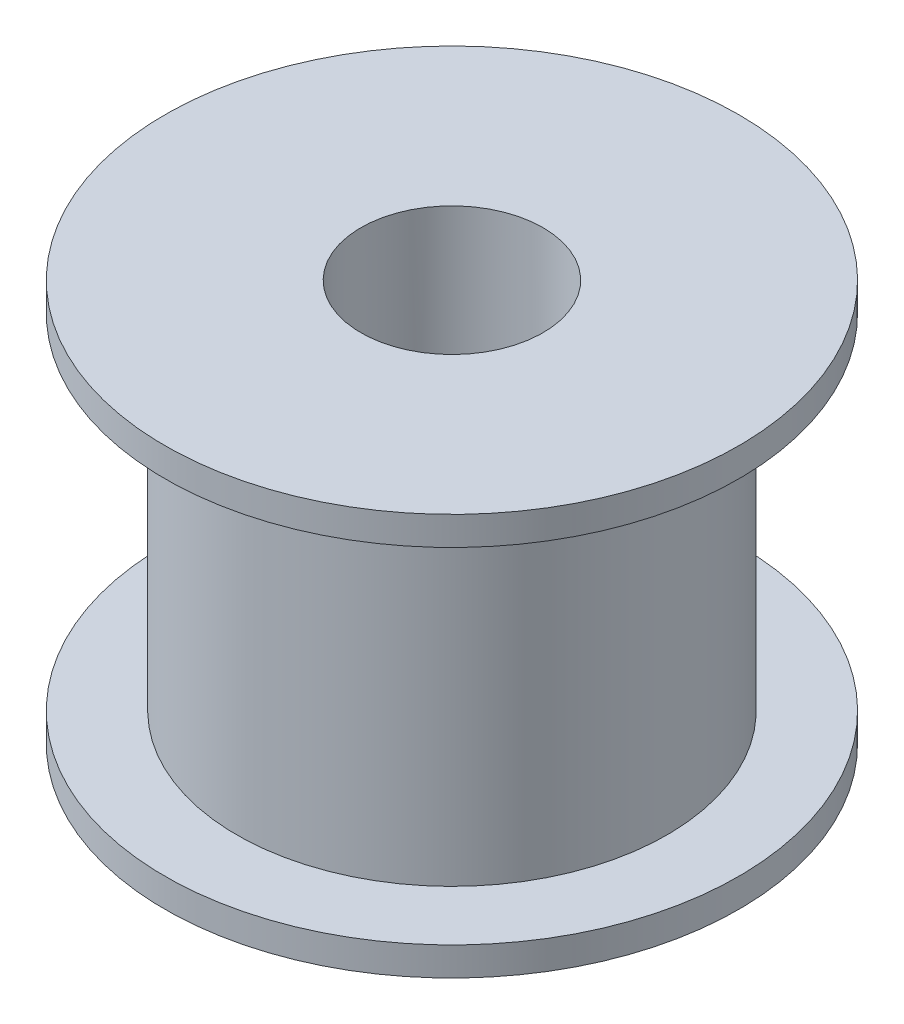
ISO-10303-21;
HEADER;
FILE_DESCRIPTION(('STEP AP214'),'2;1');
FILE_NAME('part.step','',(''),(''),'','','');
FILE_SCHEMA(('AUTOMOTIVE_DESIGN { 1 0 10303 214 1 1 1 1 }'));
ENDSEC;
DATA;
#1=APPLICATION_CONTEXT('core data for automotive mechanical design processes');
#2=APPLICATION_PROTOCOL_DEFINITION('international standard','automotive_design',2000,#1);
#3=PRODUCT_CONTEXT('',#1,'mechanical');
#4=PRODUCT('Part','Part','',(#3));
#5=PRODUCT_RELATED_PRODUCT_CATEGORY('part','',(#4));
#6=PRODUCT_DEFINITION_FORMATION('','',#4);
#7=PRODUCT_DEFINITION_CONTEXT('part definition',#1,'design');
#8=PRODUCT_DEFINITION('design','',#6,#7);
#9=PRODUCT_DEFINITION_SHAPE('','',#8);
#10=(LENGTH_UNIT() NAMED_UNIT(*) SI_UNIT(.MILLI.,.METRE.));
#11=(NAMED_UNIT(*) PLANE_ANGLE_UNIT() SI_UNIT($,.RADIAN.));
#12=(NAMED_UNIT(*) SI_UNIT($,.STERADIAN.) SOLID_ANGLE_UNIT());
#13=UNCERTAINTY_MEASURE_WITH_UNIT(LENGTH_MEASURE(1.E-05),#10,'distance_accuracy_value','');
#14=(GEOMETRIC_REPRESENTATION_CONTEXT(3) GLOBAL_UNCERTAINTY_ASSIGNED_CONTEXT((#13)) GLOBAL_UNIT_ASSIGNED_CONTEXT((#10,
#11,#12)) REPRESENTATION_CONTEXT('',''));
#15=CARTESIAN_POINT('',(0.,0.,0.));
#16=DIRECTION('',(0.,0.,1.));
#17=DIRECTION('',(1.,0.,0.));
#18=AXIS2_PLACEMENT_3D('',#15,#16,#17);
#19=CARTESIAN_POINT('',(-3.175,24.,0.));
#20=DIRECTION('',(0.,-1.,0.));
#21=DIRECTION('',(0.,0.,-1.));
#22=AXIS2_PLACEMENT_3D('',#19,#20,#21);
#23=PLANE('',#22);
#24=CARTESIAN_POINT('',(0.,24.,0.));
#25=DIRECTION('',(0.,-1.,0.));
#26=DIRECTION('',(0.,0.,-1.));
#27=AXIS2_PLACEMENT_3D('',#24,#25,#26);
#28=CIRCLE('',#27,10.);
#29=CARTESIAN_POINT('',(0.,24.,-10.));
#30=VERTEX_POINT('',#29);
#31=EDGE_CURVE('E10',#30,#30,#28,.T.);
#32=ORIENTED_EDGE('',*,*,#31,.F.);
#33=EDGE_LOOP('',(#32));
#34=FACE_BOUND('',#33,.T.);
#35=CARTESIAN_POINT('',(0.,24.,0.));
#36=DIRECTION('',(0.,-1.,0.));
#37=DIRECTION('',(0.,0.,-1.));
#38=AXIS2_PLACEMENT_3D('',#35,#36,#37);
#39=CIRCLE('',#38,3.175);
#40=CARTESIAN_POINT('',(0.,24.,-3.175));
#41=VERTEX_POINT('',#40);
#42=EDGE_CURVE('E58',#41,#41,#39,.T.);
#43=ORIENTED_EDGE('',*,*,#42,.T.);
#44=EDGE_LOOP('',(#43));
#45=FACE_BOUND('',#44,.T.);
#46=ADVANCED_FACE('F30',(#34,#45),#23,.F.);
#47=CARTESIAN_POINT('',(0.,0.,0.));
#48=DIRECTION('',(0.,-1.,0.));
#49=DIRECTION('',(0.,0.,-1.));
#50=AXIS2_PLACEMENT_3D('',#47,#48,#49);
#51=CYLINDRICAL_SURFACE('',#50,10.);
#52=CARTESIAN_POINT('',(0.,23.,0.));
#53=DIRECTION('',(0.,-1.,0.));
#54=DIRECTION('',(0.,0.,-1.));
#55=AXIS2_PLACEMENT_3D('',#52,#53,#54);
#56=CIRCLE('',#55,10.);
#57=CARTESIAN_POINT('',(0.,23.,-10.));
#58=VERTEX_POINT('',#57);
#59=EDGE_CURVE('E36',#58,#58,#56,.T.);
#60=ORIENTED_EDGE('',*,*,#59,.F.);
#61=EDGE_LOOP('',(#60));
#62=FACE_BOUND('',#61,.T.);
#63=ORIENTED_EDGE('',*,*,#31,.T.);
#64=EDGE_LOOP('',(#63));
#65=FACE_BOUND('',#64,.T.);
#66=ADVANCED_FACE('F137',(#62,#65),#51,.T.);
#67=CARTESIAN_POINT('',(-10.,23.,0.));
#68=DIRECTION('',(0.,1.,0.));
#69=DIRECTION('',(0.,0.,1.));
#70=AXIS2_PLACEMENT_3D('',#67,#68,#69);
#71=PLANE('',#70);
#72=CARTESIAN_POINT('',(0.,23.,0.));
#73=DIRECTION('',(0.,-1.,0.));
#74=DIRECTION('',(0.,0.,-1.));
#75=AXIS2_PLACEMENT_3D('',#72,#73,#74);
#76=CIRCLE('',#75,7.5);
#77=CARTESIAN_POINT('',(0.,23.,-7.5));
#78=VERTEX_POINT('',#77);
#79=EDGE_CURVE('E40',#78,#78,#76,.T.);
#80=ORIENTED_EDGE('',*,*,#79,.F.);
#81=EDGE_LOOP('',(#80));
#82=FACE_BOUND('',#81,.T.);
#83=ORIENTED_EDGE('',*,*,#59,.T.);
#84=EDGE_LOOP('',(#83));
#85=FACE_BOUND('',#84,.T.);
#86=ADVANCED_FACE('F131',(#82,#85),#71,.F.);
#87=CARTESIAN_POINT('',(0.,0.,0.));
#88=DIRECTION('',(0.,-1.,0.));
#89=DIRECTION('',(0.,0.,-1.));
#90=AXIS2_PLACEMENT_3D('',#87,#88,#89);
#91=CYLINDRICAL_SURFACE('',#90,7.5);
#92=CARTESIAN_POINT('',(-7.32734604068895,17.,-1.6));
#93=CARTESIAN_POINT('',(-7.32734783204889,16.9112314899289,-1.59999687521768));
#94=CARTESIAN_POINT('',(-7.32897670533243,16.8224249007057,-1.59258752711157));
#95=CARTESIAN_POINT('',(-7.33530494590012,16.6473332925828,-1.56317603196586));
#96=CARTESIAN_POINT('',(-7.3400066031465,16.5610502044393,-1.54116300148996));
#97=CARTESIAN_POINT('',(-7.35192423987446,16.3935637933243,-1.48326555897742));
#98=CARTESIAN_POINT('',(-7.3591375365424,16.3123551587954,-1.44739594342864));
#99=CARTESIAN_POINT('',(-7.37526247893005,16.1571077412959,-1.36284536038589));
#100=CARTESIAN_POINT('',(-7.38417407205336,16.0830687363883,-1.31416478963062));
#101=CARTESIAN_POINT('',(-7.40285153964238,15.9430701608376,-1.20454002688148));
#102=CARTESIAN_POINT('',(-7.4126278874916,15.8772426226148,-1.14342897607145));
#103=CARTESIAN_POINT('',(-7.43184148234544,15.7566908376894,-1.01103827358584));
#104=CARTESIAN_POINT('',(-7.44127870373573,15.7019674282403,-0.939757855827598));
#105=CARTESIAN_POINT('',(-7.45886446546389,15.6046579528831,-0.788169783859915));
#106=CARTESIAN_POINT('',(-7.46699920907061,15.5621984300098,-0.707779159305539));
#107=CARTESIAN_POINT('',(-7.48094533800134,15.4914400546686,-0.540801563567201));
#108=CARTESIAN_POINT('',(-7.48675697112518,15.4631396918008,-0.454215254422201));
#109=CARTESIAN_POINT('',(-7.4953280596337,15.4219169903913,-0.278676257286041));
#110=CARTESIAN_POINT('',(-7.49813179441585,15.4087713368266,-0.18977820986477));
#111=CARTESIAN_POINT('',(-7.5005244520832,15.3975334366144,-0.0109972872482612));
#112=CARTESIAN_POINT('',(-7.50011372555284,15.3994395483502,0.0788854794810509));
#113=CARTESIAN_POINT('',(-7.49615771852237,15.418083843682,0.255546402374117));
#114=CARTESIAN_POINT('',(-7.49266329963279,15.4345813702771,0.342351262803164));
#115=CARTESIAN_POINT('',(-7.48299031427627,15.4815572251576,0.511931382190348));
#116=CARTESIAN_POINT('',(-7.47681163040705,15.5120361649543,0.594706464721118));
#117=CARTESIAN_POINT('',(-7.46238195623953,15.5863255042797,0.754550882880952));
#118=CARTESIAN_POINT('',(-7.45411671633685,15.6302280308911,0.831576062489075));
#119=CARTESIAN_POINT('',(-7.43642166419509,15.7300497756313,0.97725415116399));
#120=CARTESIAN_POINT('',(-7.42699170062309,15.7859705559954,1.04590596996944));
#121=CARTESIAN_POINT('',(-7.40778511114788,15.9095546332628,1.1743189871499));
#122=CARTESIAN_POINT('',(-7.39800531840364,15.9774285621819,1.23387717194844));
#123=CARTESIAN_POINT('',(-7.37937693038443,16.1223014247692,1.34080220178098));
#124=CARTESIAN_POINT('',(-7.37052835793311,16.1993005819931,1.38816874804634));
#125=CARTESIAN_POINT('',(-7.35475651444397,16.3605554789535,1.46945010087399));
#126=CARTESIAN_POINT('',(-7.34783851514439,16.444830281057,1.50332818047939));
#127=CARTESIAN_POINT('',(-7.33678531116542,16.6180587849084,1.55638146230778));
#128=CARTESIAN_POINT('',(-7.33264968873186,16.7070117820952,1.57555887179257));
#129=CARTESIAN_POINT('',(-7.32771425542105,16.8852210599988,1.59835496135295));
#130=CARTESIAN_POINT('',(-7.32685123090565,16.9744379131568,1.60226852153074));
#131=CARTESIAN_POINT('',(-7.32838843572104,17.1522493322131,1.59522273599979));
#132=CARTESIAN_POINT('',(-7.33078845261626,17.2408439382445,1.58426435850705));
#133=CARTESIAN_POINT('',(-7.33852177157955,17.4138798323811,1.54804113817799));
#134=CARTESIAN_POINT('',(-7.34382205072082,17.4983564291054,1.52293726454489));
#135=CARTESIAN_POINT('',(-7.35672914405465,17.661904499286,1.45930930111439));
#136=CARTESIAN_POINT('',(-7.36433617007512,17.7409754755283,1.42078397878081));
#137=CARTESIAN_POINT('',(-7.38113944964658,17.8927480930833,1.3307517679701));
#138=CARTESIAN_POINT('',(-7.39035742068726,17.9653390209712,1.27906237846836));
#139=CARTESIAN_POINT('',(-7.40928600589101,18.1009246488958,1.16440942349652));
#140=CARTESIAN_POINT('',(-7.41899667801202,18.1639182164606,1.10144452944021));
#141=CARTESIAN_POINT('',(-7.43802394390857,18.2796576531446,0.964696649513287));
#142=CARTESIAN_POINT('',(-7.44733055372857,18.3322029692706,0.890742299881097));
#143=CARTESIAN_POINT('',(-7.46432047157701,18.424123625609,0.734884872162138));
#144=CARTESIAN_POINT('',(-7.47200385334324,18.4634995641094,0.652982155389736));
#145=CARTESIAN_POINT('',(-7.48483934479638,18.5276805415733,0.484049906499254));
#146=CARTESIAN_POINT('',(-7.49000699441327,18.5525752239163,0.397055665841012));
#147=CARTESIAN_POINT('',(-7.49729580275604,18.5873682679412,0.219997709997883));
#148=CARTESIAN_POINT('',(-7.49941738166686,18.5972686979895,0.129934419922699));
#149=CARTESIAN_POINT('',(-7.50036328067436,18.601703008245,-0.0487977681305984));
#150=CARTESIAN_POINT('',(-7.49925198227475,18.596536927014,-0.137459015607028));
#151=CARTESIAN_POINT('',(-7.49399416638132,18.5716534198474,-0.312618673313177));
#152=CARTESIAN_POINT('',(-7.48984769836304,18.5519362311057,-0.39911711877443));
#153=CARTESIAN_POINT('',(-7.47898934152454,18.4986509849526,-0.567277052878259));
#154=CARTESIAN_POINT('',(-7.47228498421878,18.4651235678675,-0.648951936497364));
#155=CARTESIAN_POINT('',(-7.4570285062036,18.385209972636,-0.805557846294832));
#156=CARTESIAN_POINT('',(-7.44847621571812,18.338822612891,-0.880488251937905));
#157=CARTESIAN_POINT('',(-7.43026476347601,18.233517517824,-1.02294779578885));
#158=CARTESIAN_POINT('',(-7.42058833247677,18.1743876801794,-1.09031795731115));
#159=CARTESIAN_POINT('',(-7.40131497163695,18.0457063611111,-1.21428232218523));
#160=CARTESIAN_POINT('',(-7.39171806140062,17.9761523860238,-1.27087393971624));
#161=CARTESIAN_POINT('',(-7.37355623892386,17.8275454385315,-1.37235806742357));
#162=CARTESIAN_POINT('',(-7.36500582897484,17.7483839701132,-1.41709443670196));
#163=CARTESIAN_POINT('',(-7.3500858193436,17.5835027379727,-1.49255808840325));
#164=CARTESIAN_POINT('',(-7.34371433542935,17.4977887194782,-1.5232974824127));
#165=CARTESIAN_POINT('',(-7.33507966715627,17.3432953684398,-1.56426527791603));
#166=CARTESIAN_POINT('',(-7.33219842078849,17.275367522962,-1.57764062026348));
#167=CARTESIAN_POINT('',(-7.32833095153541,17.1383007877673,-1.59550900254637));
#168=CARTESIAN_POINT('',(-7.32734464499187,17.0691619516495,-1.60000243460258));
#169=CARTESIAN_POINT('',(-7.32734604068895,17.,-1.6));
#170=B_SPLINE_CURVE_WITH_KNOTS('',3,(#92,#93,#94,#95,#96,#97,#98,#99,#100,#101,#102,#103,#104,
#105,#106,#107,#108,#109,#110,#111,#112,#113,#114,#115,#116,#117,#118,#119,#120,#121,#122,#123,
#124,#125,#126,#127,#128,#129,#130,#131,#132,#133,#134,#135,#136,#137,#138,#139,#140,#141,#142,
#143,#144,#145,#146,#147,#148,#149,#150,#151,#152,#153,#154,#155,#156,#157,#158,#159,#160,#161,
#162,#163,#164,#165,#166,#167,#168,#169),.UNSPECIFIED.,.T.,.F.,(4,2,2,2,2,2,2,2,2,2,2,2,2,2,2,2,
2,2,2,2,2,2,2,2,2,2,2,2,2,2,2,2,2,2,2,2,2,2,4),(0.,0.266052129745755,0.532302758678047,
0.798269859408133,1.06422872445041,1.33402614177927,1.60384389433342,1.87635365044247,
2.14883433092115,2.41724632343609,2.68562904207089,2.94966617354387,3.21371485442776,
3.47961802162733,3.74555577412269,4.01676058380499,4.28797203900696,4.55991699098621,
4.83182110323962,5.09844553370916,5.36505260681318,5.62868536677039,5.89234234338366,
6.15987500944547,6.42743921949375,6.69972716505267,6.9720027388247,7.24257439749418,
7.51310872903873,7.7782925828225,8.043472114006,8.3078767955156,8.57230577914047,
8.84153310165344,9.11082493186949,9.38350466142434,9.6559479906485,9.86324556645522,
10.0705339902329),.UNSPECIFIED.);
#171=CARTESIAN_POINT('',(-7.32734604068895,17.,-1.6));
#172=VERTEX_POINT('',#171);
#173=EDGE_CURVE('E91',#172,#172,#170,.T.);
#174=ORIENTED_EDGE('',*,*,#173,.F.);
#175=EDGE_LOOP('',(#174));
#176=FACE_BOUND('',#175,.T.);
#177=CARTESIAN_POINT('',(1.6,17.,-7.32734604068895));
#178=CARTESIAN_POINT('',(1.59999687521768,16.9112314899289,-7.32734783204889));
#179=CARTESIAN_POINT('',(1.59258752711157,16.8224249007057,-7.32897670533243));
#180=CARTESIAN_POINT('',(1.56317603196586,16.6473332925828,-7.33530494590012));
#181=CARTESIAN_POINT('',(1.54116300148996,16.5610502044393,-7.3400066031465));
#182=CARTESIAN_POINT('',(1.48326555897742,16.3935637933243,-7.35192423987446));
#183=CARTESIAN_POINT('',(1.44739594342864,16.3123551587954,-7.3591375365424));
#184=CARTESIAN_POINT('',(1.36284536038589,16.1571077412959,-7.37526247893005));
#185=CARTESIAN_POINT('',(1.31416478963062,16.0830687363883,-7.38417407205336));
#186=CARTESIAN_POINT('',(1.20454002688148,15.9430701608376,-7.40285153964238));
#187=CARTESIAN_POINT('',(1.14342897607145,15.8772426226148,-7.4126278874916));
#188=CARTESIAN_POINT('',(1.01103827358584,15.7566908376894,-7.43184148234544));
#189=CARTESIAN_POINT('',(0.939757855827598,15.7019674282403,-7.44127870373573));
#190=CARTESIAN_POINT('',(0.788169783859915,15.6046579528831,-7.45886446546389));
#191=CARTESIAN_POINT('',(0.707779159305539,15.5621984300098,-7.46699920907061));
#192=CARTESIAN_POINT('',(0.540801563567201,15.4914400546686,-7.48094533800134));
#193=CARTESIAN_POINT('',(0.4542152544222,15.4631396918008,-7.48675697112518));
#194=CARTESIAN_POINT('',(0.278676257286041,15.4219169903913,-7.4953280596337));
#195=CARTESIAN_POINT('',(0.189778209864771,15.4087713368266,-7.49813179441585));
#196=CARTESIAN_POINT('',(0.0109972872482615,15.3975334366144,-7.5005244520832));
#197=CARTESIAN_POINT('',(-0.0788854794810507,15.3994395483502,-7.50011372555284));
#198=CARTESIAN_POINT('',(-0.255546402374117,15.418083843682,-7.49615771852237));
#199=CARTESIAN_POINT('',(-0.342351262803164,15.4345813702771,-7.49266329963279));
#200=CARTESIAN_POINT('',(-0.511931382190348,15.4815572251576,-7.48299031427627));
#201=CARTESIAN_POINT('',(-0.594706464721118,15.5120361649543,-7.47681163040705));
#202=CARTESIAN_POINT('',(-0.754550882880952,15.5863255042797,-7.46238195623953));
#203=CARTESIAN_POINT('',(-0.831576062489075,15.6302280308911,-7.45411671633685));
#204=CARTESIAN_POINT('',(-0.97725415116399,15.7300497756313,-7.43642166419509));
#205=CARTESIAN_POINT('',(-1.04590596996944,15.7859705559954,-7.42699170062309));
#206=CARTESIAN_POINT('',(-1.1743189871499,15.9095546332628,-7.40778511114788));
#207=CARTESIAN_POINT('',(-1.23387717194844,15.9774285621819,-7.39800531840364));
#208=CARTESIAN_POINT('',(-1.34080220178098,16.1223014247692,-7.37937693038443));
#209=CARTESIAN_POINT('',(-1.38816874804634,16.1993005819931,-7.37052835793311));
#210=CARTESIAN_POINT('',(-1.46945010087399,16.3605554789535,-7.35475651444397));
#211=CARTESIAN_POINT('',(-1.50332818047939,16.444830281057,-7.34783851514439));
#212=CARTESIAN_POINT('',(-1.55638146230778,16.6180587849084,-7.33678531116542));
#213=CARTESIAN_POINT('',(-1.57555887179257,16.7070117820952,-7.33264968873186));
#214=CARTESIAN_POINT('',(-1.59835496135295,16.8852210599988,-7.32771425542105));
#215=CARTESIAN_POINT('',(-1.60226852153074,16.9744379131568,-7.32685123090565));
#216=CARTESIAN_POINT('',(-1.59522273599979,17.1522493322131,-7.32838843572104));
#217=CARTESIAN_POINT('',(-1.58426435850705,17.2408439382445,-7.33078845261626));
#218=CARTESIAN_POINT('',(-1.54804113817799,17.4138798323811,-7.33852177157955));
#219=CARTESIAN_POINT('',(-1.52293726454489,17.4983564291054,-7.34382205072082));
#220=CARTESIAN_POINT('',(-1.45930930111439,17.661904499286,-7.35672914405465));
#221=CARTESIAN_POINT('',(-1.42078397878081,17.7409754755283,-7.36433617007512));
#222=CARTESIAN_POINT('',(-1.3307517679701,17.8927480930833,-7.38113944964658));
#223=CARTESIAN_POINT('',(-1.27906237846836,17.9653390209712,-7.39035742068726));
#224=CARTESIAN_POINT('',(-1.16440942349652,18.1009246488958,-7.40928600589101));
#225=CARTESIAN_POINT('',(-1.10144452944021,18.1639182164606,-7.41899667801202));
#226=CARTESIAN_POINT('',(-0.964696649513287,18.2796576531446,-7.43802394390857));
#227=CARTESIAN_POINT('',(-0.890742299881097,18.3322029692706,-7.44733055372857));
#228=CARTESIAN_POINT('',(-0.734884872162138,18.424123625609,-7.46432047157701));
#229=CARTESIAN_POINT('',(-0.652982155389736,18.4634995641094,-7.47200385334324));
#230=CARTESIAN_POINT('',(-0.484049906499254,18.5276805415733,-7.48483934479638));
#231=CARTESIAN_POINT('',(-0.397055665841012,18.5525752239163,-7.49000699441327));
#232=CARTESIAN_POINT('',(-0.219997709997883,18.5873682679412,-7.49729580275604));
#233=CARTESIAN_POINT('',(-0.129934419922699,18.5972686979895,-7.49941738166686));
#234=CARTESIAN_POINT('',(0.0487977681305985,18.601703008245,-7.50036328067436));
#235=CARTESIAN_POINT('',(0.137459015607028,18.596536927014,-7.49925198227475));
#236=CARTESIAN_POINT('',(0.312618673313177,18.5716534198474,-7.49399416638132));
#237=CARTESIAN_POINT('',(0.39911711877443,18.5519362311057,-7.48984769836304));
#238=CARTESIAN_POINT('',(0.567277052878258,18.4986509849526,-7.47898934152454));
#239=CARTESIAN_POINT('',(0.648951936497363,18.4651235678675,-7.47228498421878));
#240=CARTESIAN_POINT('',(0.805557846294832,18.385209972636,-7.4570285062036));
#241=CARTESIAN_POINT('',(0.880488251937906,18.338822612891,-7.44847621571812));
#242=CARTESIAN_POINT('',(1.02294779578885,18.233517517824,-7.43026476347601));
#243=CARTESIAN_POINT('',(1.09031795731116,18.1743876801794,-7.42058833247677));
#244=CARTESIAN_POINT('',(1.21428232218523,18.0457063611111,-7.40131497163695));
#245=CARTESIAN_POINT('',(1.27087393971624,17.9761523860238,-7.39171806140062));
#246=CARTESIAN_POINT('',(1.37235806742357,17.8275454385315,-7.37355623892386));
#247=CARTESIAN_POINT('',(1.41709443670196,17.7483839701132,-7.36500582897484));
#248=CARTESIAN_POINT('',(1.49255808840325,17.5835027379727,-7.3500858193436));
#249=CARTESIAN_POINT('',(1.5232974824127,17.4977887194782,-7.34371433542935));
#250=CARTESIAN_POINT('',(1.56426527791603,17.3432953684398,-7.33507966715627));
#251=CARTESIAN_POINT('',(1.57764062026348,17.275367522962,-7.33219842078849));
#252=CARTESIAN_POINT('',(1.59550900254637,17.1383007877673,-7.32833095153541));
#253=CARTESIAN_POINT('',(1.60000243460258,17.0691619516495,-7.32734464499187));
#254=CARTESIAN_POINT('',(1.6,17.,-7.32734604068895));
#255=B_SPLINE_CURVE_WITH_KNOTS('',3,(#177,#178,#179,#180,#181,#182,#183,#184,#185,#186,#187,
#188,#189,#190,#191,#192,#193,#194,#195,#196,#197,#198,#199,#200,#201,#202,#203,#204,#205,#206,
#207,#208,#209,#210,#211,#212,#213,#214,#215,#216,#217,#218,#219,#220,#221,#222,#223,#224,#225,
#226,#227,#228,#229,#230,#231,#232,#233,#234,#235,#236,#237,#238,#239,#240,#241,#242,#243,#244,
#245,#246,#247,#248,#249,#250,#251,#252,#253,#254),.UNSPECIFIED.,.T.,.F.,(4,2,2,2,2,2,2,2,2,2,2,
2,2,2,2,2,2,2,2,2,2,2,2,2,2,2,2,2,2,2,2,2,2,2,2,2,2,2,4),(0.,0.266052129745755,
0.532302758678047,0.798269859408133,1.06422872445041,1.33402614177927,1.60384389433342,
1.87635365044247,2.14883433092115,2.41724632343609,2.68562904207089,2.94966617354387,
3.21371485442776,3.47961802162733,3.74555577412269,4.01676058380499,4.28797203900696,
4.55991699098621,4.83182110323963,5.09844553370916,5.36505260681319,5.62868536677039,
5.89234234338366,6.15987500944547,6.42743921949376,6.69972716505267,6.9720027388247,
7.24257439749418,7.51310872903874,7.77829258282251,8.043472114006,8.3078767955156,
8.57230577914047,8.84153310165344,9.11082493186949,9.38350466142434,9.6559479906485,
9.86324556645523,10.0705339902329),.UNSPECIFIED.);
#256=CARTESIAN_POINT('',(1.6,17.,-7.32734604068895));
#257=VERTEX_POINT('',#256);
#258=EDGE_CURVE('E61',#257,#257,#255,.T.);
#259=ORIENTED_EDGE('',*,*,#258,.F.);
#260=EDGE_LOOP('',(#259));
#261=FACE_BOUND('',#260,.T.);
#262=CARTESIAN_POINT('',(0.,11.,0.));
#263=DIRECTION('',(0.,-1.,0.));
#264=DIRECTION('',(0.,0.,-1.));
#265=AXIS2_PLACEMENT_3D('',#262,#263,#264);
#266=CIRCLE('',#265,7.5);
#267=CARTESIAN_POINT('',(0.,11.,-7.5));
#268=VERTEX_POINT('',#267);
#269=EDGE_CURVE('E44',#268,#268,#266,.T.);
#270=ORIENTED_EDGE('',*,*,#269,.F.);
#271=EDGE_LOOP('',(#270));
#272=FACE_BOUND('',#271,.T.);
#273=ORIENTED_EDGE('',*,*,#79,.T.);
#274=EDGE_LOOP('',(#273));
#275=FACE_BOUND('',#274,.T.);
#276=ADVANCED_FACE('F125',(#176,#261,#272,#275),#91,.T.);
#277=CARTESIAN_POINT('',(-7.5,11.,0.));
#278=DIRECTION('',(0.,-1.,0.));
#279=DIRECTION('',(0.,0.,-1.));
#280=AXIS2_PLACEMENT_3D('',#277,#278,#279);
#281=PLANE('',#280);
#282=CARTESIAN_POINT('',(0.,11.,0.));
#283=DIRECTION('',(0.,-1.,0.));
#284=DIRECTION('',(0.,0.,-1.));
#285=AXIS2_PLACEMENT_3D('',#282,#283,#284);
#286=CIRCLE('',#285,10.);
#287=CARTESIAN_POINT('',(0.,11.,-10.));
#288=VERTEX_POINT('',#287);
#289=EDGE_CURVE('E49',#288,#288,#286,.T.);
#290=ORIENTED_EDGE('',*,*,#289,.F.);
#291=EDGE_LOOP('',(#290));
#292=FACE_BOUND('',#291,.T.);
#293=ORIENTED_EDGE('',*,*,#269,.T.);
#294=EDGE_LOOP('',(#293));
#295=FACE_BOUND('',#294,.T.);
#296=ADVANCED_FACE('F119',(#292,#295),#281,.F.);
#297=CARTESIAN_POINT('',(0.,0.,0.));
#298=DIRECTION('',(0.,-1.,0.));
#299=DIRECTION('',(0.,0.,-1.));
#300=AXIS2_PLACEMENT_3D('',#297,#298,#299);
#301=CYLINDRICAL_SURFACE('',#300,10.);
#302=CARTESIAN_POINT('',(0.,10.,0.));
#303=DIRECTION('',(0.,-1.,0.));
#304=DIRECTION('',(0.,0.,-1.));
#305=AXIS2_PLACEMENT_3D('',#302,#303,#304);
#306=CIRCLE('',#305,10.);
#307=CARTESIAN_POINT('',(0.,10.,-10.));
#308=VERTEX_POINT('',#307);
#309=EDGE_CURVE('E52',#308,#308,#306,.T.);
#310=ORIENTED_EDGE('',*,*,#309,.F.);
#311=EDGE_LOOP('',(#310));
#312=FACE_BOUND('',#311,.T.);
#313=ORIENTED_EDGE('',*,*,#289,.T.);
#314=EDGE_LOOP('',(#313));
#315=FACE_BOUND('',#314,.T.);
#316=ADVANCED_FACE('F113',(#312,#315),#301,.T.);
#317=CARTESIAN_POINT('',(-10.,10.,0.));
#318=DIRECTION('',(0.,1.,0.));
#319=DIRECTION('',(0.,0.,1.));
#320=AXIS2_PLACEMENT_3D('',#317,#318,#319);
#321=PLANE('',#320);
#322=CARTESIAN_POINT('',(0.,10.,0.));
#323=DIRECTION('',(0.,-1.,0.));
#324=DIRECTION('',(0.,0.,-1.));
#325=AXIS2_PLACEMENT_3D('',#322,#323,#324);
#326=CIRCLE('',#325,3.175);
#327=CARTESIAN_POINT('',(0.,10.,-3.175));
#328=VERTEX_POINT('',#327);
#329=EDGE_CURVE('E55',#328,#328,#326,.T.);
#330=ORIENTED_EDGE('',*,*,#329,.F.);
#331=EDGE_LOOP('',(#330));
#332=FACE_BOUND('',#331,.T.);
#333=ORIENTED_EDGE('',*,*,#309,.T.);
#334=EDGE_LOOP('',(#333));
#335=FACE_BOUND('',#334,.T.);
#336=ADVANCED_FACE('F104',(#332,#335),#321,.F.);
#337=CARTESIAN_POINT('',(0.,0.,0.));
#338=DIRECTION('',(0.,-1.,0.));
#339=DIRECTION('',(0.,0.,-1.));
#340=AXIS2_PLACEMENT_3D('',#337,#338,#339);
#341=CYLINDRICAL_SURFACE('',#340,3.175);
#342=CARTESIAN_POINT('',(-2.74237579481733,17.,-1.6));
#343=CARTESIAN_POINT('',(-2.74238322667206,17.0832699364511,-1.59999409828236));
#344=CARTESIAN_POINT('',(-2.7462262771076,17.1666426890416,-1.59345594095629));
#345=CARTESIAN_POINT('',(-2.76103891600173,17.330820954185,-1.56764039311598));
#346=CARTESIAN_POINT('',(-2.77202324178174,17.4116207945473,-1.54833665708846));
#347=CARTESIAN_POINT('',(-2.79951989271487,17.567967365311,-1.49803942170456));
#348=CARTESIAN_POINT('',(-2.81600241257337,17.6435398219172,-1.46710883830566));
#349=CARTESIAN_POINT('',(-2.85259189312104,17.7884033971539,-1.39462815503852));
#350=CARTESIAN_POINT('',(-2.87269909865681,17.8576940909776,-1.35307733769691));
#351=CARTESIAN_POINT('',(-2.9163318794555,17.9944418404887,-1.25645091798638));
#352=CARTESIAN_POINT('',(-2.94000271510108,18.0612578953452,-1.20053335997292));
#353=CARTESIAN_POINT('',(-2.98692383278696,18.1850631648608,-1.07851067168893));
#354=CARTESIAN_POINT('',(-3.01017389691271,18.2420474110941,-1.01240042239061));
#355=CARTESIAN_POINT('',(-3.05554497513519,18.3484073718669,-0.866316999954483));
#356=CARTESIAN_POINT('',(-3.07747851763362,18.396990815453,-0.785703272999906));
#357=CARTESIAN_POINT('',(-3.11585271703655,18.4796133936732,-0.616134179850148));
#358=CARTESIAN_POINT('',(-3.13229689275994,18.5136618495098,-0.527184204418019));
#359=CARTESIAN_POINT('',(-3.15679149254213,18.5636966864172,-0.350261947749634));
#360=CARTESIAN_POINT('',(-3.16536155812813,18.5808082046044,-0.262681446513982));
#361=CARTESIAN_POINT('',(-3.17508523498231,18.6001925073815,-0.0855059819590337));
#362=CARTESIAN_POINT('',(-3.1762434153916,18.6024744338556,0.00408770611325682));
#363=CARTESIAN_POINT('',(-3.17125583080396,18.5925604754312,0.174271524202444));
#364=CARTESIAN_POINT('',(-3.16574598879838,18.5816252187227,0.254958102033297));
#365=CARTESIAN_POINT('',(-3.14900700281078,18.5478484342428,0.413169622031287));
#366=CARTESIAN_POINT('',(-3.13777743026873,18.5250060143049,0.490694326819812));
#367=CARTESIAN_POINT('',(-3.11043322512666,18.4679250666261,0.641721173792756));
#368=CARTESIAN_POINT('',(-3.09425396362022,18.4335351435829,0.715153909547708));
#369=CARTESIAN_POINT('',(-3.058462348495,18.3545498652013,0.855381664203148));
#370=CARTESIAN_POINT('',(-3.03884877310609,18.309950876208,0.92217430756357));
#371=CARTESIAN_POINT('',(-2.99581012111649,18.2069174997902,1.05404225840651));
#372=CARTESIAN_POINT('',(-2.97219991917346,18.1475679366951,1.11834262495356));
#373=CARTESIAN_POINT('',(-2.92502146556387,18.0191623305211,1.23649918721492));
#374=CARTESIAN_POINT('',(-2.9014532615084,17.9500986885075,1.29034712716727));
#375=CARTESIAN_POINT('',(-2.85535389917171,17.7987147824166,1.3895192059088));
#376=CARTESIAN_POINT('',(-2.83299081227843,17.7158235035468,1.43405767486966));
#377=CARTESIAN_POINT('',(-2.79421793324474,17.5423411710384,1.50822404102921));
#378=CARTESIAN_POINT('',(-2.77780185637342,17.4517583714517,1.53786769179912));
#379=CARTESIAN_POINT('',(-2.75462785520872,17.2730412228393,1.57897749681997));
#380=CARTESIAN_POINT('',(-2.74720500027534,17.1852861904305,1.59170305201947));
#381=CARTESIAN_POINT('',(-2.74097253698397,17.0086022169072,1.60241768858886));
#382=CARTESIAN_POINT('',(-2.74215661840832,16.9196741835228,1.60041756614779));
#383=CARTESIAN_POINT('',(-2.75229834728186,16.7537929685817,1.58289366512008));
#384=CARTESIAN_POINT('',(-2.76037067540211,16.6766139457487,1.5689093245598));
#385=CARTESIAN_POINT('',(-2.78206235953571,16.5258498816309,1.53011246549953));
#386=CARTESIAN_POINT('',(-2.79568354862651,16.4522660370255,1.50529636851313));
#387=CARTESIAN_POINT('',(-2.82767325489764,16.3069064099281,1.44434090494768));
#388=CARTESIAN_POINT('',(-2.84623206696729,16.2353713237005,1.40773126321788));
#389=CARTESIAN_POINT('',(-2.88584187668342,16.0990441833712,1.32463553201234));
#390=CARTESIAN_POINT('',(-2.90689415418678,16.0342556244971,1.27814436068979));
#391=CARTESIAN_POINT('',(-2.9523684473901,15.9045522825079,1.1696282359925));
#392=CARTESIAN_POINT('',(-2.97687595054491,15.840690302286,1.10637503532311));
#393=CARTESIAN_POINT('',(-3.02416597475325,15.7241497058085,0.969677905830435));
#394=CARTESIAN_POINT('',(-3.04694788172075,15.6714750588588,0.896230375254521));
#395=CARTESIAN_POINT('',(-3.08904338476405,15.5775450626546,0.738430356105694));
#396=CARTESIAN_POINT('',(-3.1082420306747,15.5366506793145,0.653830145297849));
#397=CARTESIAN_POINT('',(-3.14012800160356,15.470085542598,0.477705090096848));
#398=CARTESIAN_POINT('',(-3.15282113095083,15.4444012153667,0.386186502360243));
#399=CARTESIAN_POINT('',(-3.1693259902056,15.4112312956997,0.207976583392744));
#400=CARTESIAN_POINT('',(-3.17385170499796,15.4022798979163,0.121623755595398));
#401=CARTESIAN_POINT('',(-3.17576062221153,15.3984894596021,-0.0514575120255187));
#402=CARTESIAN_POINT('',(-3.17314640705484,15.4036453166574,-0.138185804719489));
#403=CARTESIAN_POINT('',(-3.16148491175522,15.4269611681691,-0.303376761968582));
#404=CARTESIAN_POINT('',(-3.15288449278091,15.4442184418797,-0.382001835290235));
#405=CARTESIAN_POINT('',(-3.13053898927271,15.4900172725986,-0.535107398410226));
#406=CARTESIAN_POINT('',(-3.11679317796933,15.5185604237315,-0.609587301009142));
#407=CARTESIAN_POINT('',(-3.084669247032,15.5873701689891,-0.755833414635393));
#408=CARTESIAN_POINT('',(-3.06611975409428,15.6280816515481,-0.827351513445772));
#409=CARTESIAN_POINT('',(-3.02631295567013,15.7195163576824,-0.962833864029628));
#410=CARTESIAN_POINT('',(-3.00505441190799,15.7702441654666,-1.02679463550825));
#411=CARTESIAN_POINT('',(-2.95940112846906,15.8861994689179,-1.15215254646606));
#412=CARTESIAN_POINT('',(-2.93490635795314,15.9523734668787,-1.21264008263488));
#413=CARTESIAN_POINT('',(-2.88730233733949,16.0942668426341,-1.32199715444738));
#414=CARTESIAN_POINT('',(-2.86419436079369,16.1699948021237,-1.37085612958869));
#415=CARTESIAN_POINT('',(-2.82138374321878,16.3322385604659,-1.45698838019296));
#416=CARTESIAN_POINT('',(-2.80182377190337,16.4190338030253,-1.4938107352342));
#417=CARTESIAN_POINT('',(-2.77016429082654,16.5988503495191,-1.55175141789198));
#418=CARTESIAN_POINT('',(-2.75803988495887,16.6918497077491,-1.57292220031439));
#419=CARTESIAN_POINT('',(-2.74794431421452,16.8215745431095,-1.59042358063049));
#420=CARTESIAN_POINT('',(-2.74586377042201,16.8571253866362,-1.59400896987562));
#421=CARTESIAN_POINT('',(-2.74307786742469,16.928444480217,-1.59879852791637));
#422=CARTESIAN_POINT('',(-2.74237260079926,16.9642127447446,-1.60000253640491));
#423=CARTESIAN_POINT('',(-2.74237579481733,17.,-1.6));
#424=B_SPLINE_CURVE_WITH_KNOTS('',3,(#342,#343,#344,#345,#346,#347,#348,#349,#350,#351,#352,
#353,#354,#355,#356,#357,#358,#359,#360,#361,#362,#363,#364,#365,#366,#367,#368,#369,#370,#371,
#372,#373,#374,#375,#376,#377,#378,#379,#380,#381,#382,#383,#384,#385,#386,#387,#388,#389,#390,
#391,#392,#393,#394,#395,#396,#397,#398,#399,#400,#401,#402,#403,#404,#405,#406,#407,#408,#409,
#410,#411,#412,#413,#414,#415,#416,#417,#418,#419,#420,#421,#422,#423),.UNSPECIFIED.,.T.,.F.,(4,
2,2,2,2,2,2,2,2,2,2,2,2,2,2,2,2,2,2,2,2,2,2,2,2,2,2,2,2,2,2,2,2,2,2,2,2,2,2,2,4),(0.,
0.24965916162641,0.499835182840421,0.748676480431191,0.997534593491197,1.26726093360262,
1.53712318105446,1.82553574595792,2.11376307470556,2.38121229505621,2.64849662739132,
2.89217919532944,3.13588002426335,3.38290950709528,3.63002705081554,3.90077451677004,
4.17173496788037,4.46037961025429,4.74871832031093,5.0140988597452,5.2792848537682,
5.5147757294913,5.75034446326964,5.99679930474883,6.24338120037861,6.52163719564055,
6.79999175280499,7.08613885548072,7.37203020659845,7.63143016266965,7.89073630949237,
8.13251184619773,8.37432154578449,8.6263613223651,8.87851671942874,9.15611069031345,
9.43395580494458,9.72125744911212,10.0075918083287,10.1148816074491,10.2221786287362),.UNSPECIFIED.);
#425=CARTESIAN_POINT('',(-2.74237579481733,17.,-1.6));
#426=VERTEX_POINT('',#425);
#427=EDGE_CURVE('E88',#426,#426,#424,.T.);
#428=ORIENTED_EDGE('',*,*,#427,.F.);
#429=EDGE_LOOP('',(#428));
#430=FACE_BOUND('',#429,.T.);
#431=CARTESIAN_POINT('',(1.6,17.,-2.74237579481733));
#432=CARTESIAN_POINT('',(1.59999409828236,17.0832699364511,-2.74238322667206));
#433=CARTESIAN_POINT('',(1.59345594095629,17.1666426890416,-2.7462262771076));
#434=CARTESIAN_POINT('',(1.56764039311598,17.330820954185,-2.76103891600173));
#435=CARTESIAN_POINT('',(1.54833665708846,17.4116207945473,-2.77202324178174));
#436=CARTESIAN_POINT('',(1.49803942170456,17.567967365311,-2.79951989271487));
#437=CARTESIAN_POINT('',(1.46710883830566,17.6435398219172,-2.81600241257337));
#438=CARTESIAN_POINT('',(1.39462815503852,17.7884033971539,-2.85259189312104));
#439=CARTESIAN_POINT('',(1.35307733769691,17.8576940909776,-2.87269909865681));
#440=CARTESIAN_POINT('',(1.25645091798638,17.9944418404887,-2.9163318794555));
#441=CARTESIAN_POINT('',(1.20053335997292,18.0612578953452,-2.94000271510108));
#442=CARTESIAN_POINT('',(1.07851067168893,18.1850631648608,-2.98692383278696));
#443=CARTESIAN_POINT('',(1.01240042239061,18.2420474110941,-3.01017389691271));
#444=CARTESIAN_POINT('',(0.866316999954483,18.3484073718669,-3.05554497513519));
#445=CARTESIAN_POINT('',(0.785703272999906,18.396990815453,-3.07747851763362));
#446=CARTESIAN_POINT('',(0.616134179850148,18.4796133936732,-3.11585271703655));
#447=CARTESIAN_POINT('',(0.527184204418018,18.5136618495098,-3.13229689275994));
#448=CARTESIAN_POINT('',(0.350261947749634,18.5636966864172,-3.15679149254213));
#449=CARTESIAN_POINT('',(0.262681446513982,18.5808082046044,-3.16536155812813));
#450=CARTESIAN_POINT('',(0.0855059819590334,18.6001925073815,-3.17508523498231));
#451=CARTESIAN_POINT('',(-0.00408770611325725,18.6024744338556,-3.1762434153916));
#452=CARTESIAN_POINT('',(-0.174271524202444,18.5925604754312,-3.17125583080396));
#453=CARTESIAN_POINT('',(-0.254958102033297,18.5816252187227,-3.16574598879838));
#454=CARTESIAN_POINT('',(-0.413169622031288,18.5478484342428,-3.14900700281078));
#455=CARTESIAN_POINT('',(-0.490694326819813,18.5250060143049,-3.13777743026873));
#456=CARTESIAN_POINT('',(-0.641721173792756,18.4679250666261,-3.11043322512666));
#457=CARTESIAN_POINT('',(-0.715153909547708,18.4335351435829,-3.09425396362022));
#458=CARTESIAN_POINT('',(-0.855381664203149,18.3545498652013,-3.058462348495));
#459=CARTESIAN_POINT('',(-0.92217430756357,18.309950876208,-3.03884877310609));
#460=CARTESIAN_POINT('',(-1.05404225840651,18.2069174997902,-2.99581012111649));
#461=CARTESIAN_POINT('',(-1.11834262495356,18.1475679366951,-2.97219991917346));
#462=CARTESIAN_POINT('',(-1.23649918721492,18.0191623305211,-2.92502146556387));
#463=CARTESIAN_POINT('',(-1.29034712716727,17.9500986885075,-2.9014532615084));
#464=CARTESIAN_POINT('',(-1.3895192059088,17.7987147824166,-2.85535389917171));
#465=CARTESIAN_POINT('',(-1.43405767486966,17.7158235035468,-2.83299081227843));
#466=CARTESIAN_POINT('',(-1.50822404102921,17.5423411710384,-2.79421793324474));
#467=CARTESIAN_POINT('',(-1.53786769179912,17.4517583714517,-2.77780185637342));
#468=CARTESIAN_POINT('',(-1.57897749681997,17.2730412228393,-2.75462785520872));
#469=CARTESIAN_POINT('',(-1.59170305201947,17.1852861904305,-2.74720500027534));
#470=CARTESIAN_POINT('',(-1.60241768858886,17.0086022169071,-2.74097253698397));
#471=CARTESIAN_POINT('',(-1.60041756614779,16.9196741835228,-2.74215661840832));
#472=CARTESIAN_POINT('',(-1.58289366512008,16.7537929685817,-2.75229834728186));
#473=CARTESIAN_POINT('',(-1.5689093245598,16.6766139457487,-2.76037067540211));
#474=CARTESIAN_POINT('',(-1.53011246549953,16.5258498816308,-2.78206235953571));
#475=CARTESIAN_POINT('',(-1.50529636851313,16.4522660370255,-2.79568354862651));
#476=CARTESIAN_POINT('',(-1.44434090494768,16.3069064099281,-2.82767325489764));
#477=CARTESIAN_POINT('',(-1.40773126321788,16.2353713237005,-2.84623206696729));
#478=CARTESIAN_POINT('',(-1.32463553201234,16.0990441833712,-2.88584187668342));
#479=CARTESIAN_POINT('',(-1.27814436068979,16.0342556244971,-2.90689415418678));
#480=CARTESIAN_POINT('',(-1.1696282359925,15.9045522825079,-2.9523684473901));
#481=CARTESIAN_POINT('',(-1.1063750353231,15.840690302286,-2.97687595054491));
#482=CARTESIAN_POINT('',(-0.969677905830434,15.7241497058085,-3.02416597475325));
#483=CARTESIAN_POINT('',(-0.896230375254521,15.6714750588588,-3.04694788172075));
#484=CARTESIAN_POINT('',(-0.738430356105693,15.5775450626546,-3.08904338476405));
#485=CARTESIAN_POINT('',(-0.653830145297849,15.5366506793145,-3.1082420306747));
#486=CARTESIAN_POINT('',(-0.477705090096848,15.470085542598,-3.14012800160356));
#487=CARTESIAN_POINT('',(-0.386186502360242,15.4444012153667,-3.15282113095083));
#488=CARTESIAN_POINT('',(-0.207976583392744,15.4112312956997,-3.1693259902056));
#489=CARTESIAN_POINT('',(-0.121623755595398,15.4022798979163,-3.17385170499796));
#490=CARTESIAN_POINT('',(0.0514575120255191,15.3984894596021,-3.17576062221153));
#491=CARTESIAN_POINT('',(0.138185804719489,15.4036453166574,-3.17314640705484));
#492=CARTESIAN_POINT('',(0.303376761968582,15.4269611681691,-3.16148491175522));
#493=CARTESIAN_POINT('',(0.382001835290236,15.4442184418797,-3.15288449278091));
#494=CARTESIAN_POINT('',(0.535107398410227,15.4900172725986,-3.13053898927271));
#495=CARTESIAN_POINT('',(0.609587301009144,15.5185604237315,-3.11679317796933));
#496=CARTESIAN_POINT('',(0.755833414635394,15.5873701689891,-3.084669247032));
#497=CARTESIAN_POINT('',(0.827351513445773,15.6280816515481,-3.06611975409428));
#498=CARTESIAN_POINT('',(0.962833864029628,15.7195163576824,-3.02631295567013));
#499=CARTESIAN_POINT('',(1.02679463550825,15.7702441654666,-3.00505441190799));
#500=CARTESIAN_POINT('',(1.15215254646606,15.8861994689179,-2.95940112846906));
#501=CARTESIAN_POINT('',(1.21264008263488,15.9523734668787,-2.93490635795314));
#502=CARTESIAN_POINT('',(1.32199715444738,16.0942668426341,-2.88730233733949));
#503=CARTESIAN_POINT('',(1.37085612958869,16.1699948021237,-2.86419436079369));
#504=CARTESIAN_POINT('',(1.45698838019296,16.3322385604659,-2.82138374321878));
#505=CARTESIAN_POINT('',(1.4938107352342,16.4190338030253,-2.80182377190337));
#506=CARTESIAN_POINT('',(1.55175141789198,16.5988503495191,-2.77016429082654));
#507=CARTESIAN_POINT('',(1.57292220031439,16.6918497077491,-2.75803988495887));
#508=CARTESIAN_POINT('',(1.59042358063049,16.8215745431095,-2.74794431421452));
#509=CARTESIAN_POINT('',(1.59400896987562,16.8571253866362,-2.74586377042201));
#510=CARTESIAN_POINT('',(1.59879852791637,16.928444480217,-2.74307786742469));
#511=CARTESIAN_POINT('',(1.60000253640491,16.9642127447446,-2.74237260079926));
#512=CARTESIAN_POINT('',(1.6,17.,-2.74237579481733));
#513=B_SPLINE_CURVE_WITH_KNOTS('',3,(#431,#432,#433,#434,#435,#436,#437,#438,#439,#440,#441,
#442,#443,#444,#445,#446,#447,#448,#449,#450,#451,#452,#453,#454,#455,#456,#457,#458,#459,#460,
#461,#462,#463,#464,#465,#466,#467,#468,#469,#470,#471,#472,#473,#474,#475,#476,#477,#478,#479,
#480,#481,#482,#483,#484,#485,#486,#487,#488,#489,#490,#491,#492,#493,#494,#495,#496,#497,#498,
#499,#500,#501,#502,#503,#504,#505,#506,#507,#508,#509,#510,#511,#512),.UNSPECIFIED.,.T.,.F.,(4,
2,2,2,2,2,2,2,2,2,2,2,2,2,2,2,2,2,2,2,2,2,2,2,2,2,2,2,2,2,2,2,2,2,2,2,2,2,2,2,4),(0.,
0.24965916162641,0.499835182840421,0.748676480431191,0.997534593491197,1.26726093360262,
1.53712318105446,1.82553574595792,2.11376307470556,2.38121229505621,2.64849662739132,
2.89217919532944,3.13588002426335,3.38290950709528,3.63002705081554,3.90077451677004,
4.17173496788036,4.46037961025429,4.74871832031093,5.01409885974521,5.2792848537682,
5.5147757294913,5.75034446326963,5.99679930474882,6.24338120037861,6.52163719564055,
6.79999175280499,7.08613885548072,7.37203020659845,7.63143016266964,7.89073630949237,
8.13251184619773,8.37432154578449,8.6263613223651,8.87851671942874,9.15611069031345,
9.43395580494457,9.72125744911212,10.0075918083287,10.1148816074491,10.2221786287362),.UNSPECIFIED.);
#514=CARTESIAN_POINT('',(1.6,17.,-2.74237579481733));
#515=VERTEX_POINT('',#514);
#516=EDGE_CURVE('E68',#515,#515,#513,.T.);
#517=ORIENTED_EDGE('',*,*,#516,.F.);
#518=EDGE_LOOP('',(#517));
#519=FACE_BOUND('',#518,.T.);
#520=ORIENTED_EDGE('',*,*,#42,.F.);
#521=EDGE_LOOP('',(#520));
#522=FACE_BOUND('',#521,.T.);
#523=ORIENTED_EDGE('',*,*,#329,.T.);
#524=EDGE_LOOP('',(#523));
#525=FACE_BOUND('',#524,.T.);
#526=ADVANCED_FACE('F101',(#430,#519,#522,#525),#341,.F.);
#527=CARTESIAN_POINT('',(0.,17.,-10.001));
#528=DIRECTION('',(0.,0.,1.));
#529=DIRECTION('',(1.,0.,0.));
#530=AXIS2_PLACEMENT_3D('',#527,#528,#529);
#531=CYLINDRICAL_SURFACE('',#530,1.6);
#532=ORIENTED_EDGE('',*,*,#516,.T.);
#533=EDGE_LOOP('',(#532));
#534=FACE_BOUND('',#533,.T.);
#535=ORIENTED_EDGE('',*,*,#258,.T.);
#536=EDGE_LOOP('',(#535));
#537=FACE_BOUND('',#536,.T.);
#538=ADVANCED_FACE('F73',(#534,#537),#531,.F.);
#539=CARTESIAN_POINT('',(-10.001,17.,0.));
#540=DIRECTION('',(1.,0.,0.));
#541=DIRECTION('',(0.,0.,-1.));
#542=AXIS2_PLACEMENT_3D('',#539,#540,#541);
#543=CYLINDRICAL_SURFACE('',#542,1.6);
#544=ORIENTED_EDGE('',*,*,#427,.T.);
#545=EDGE_LOOP('',(#544));
#546=FACE_BOUND('',#545,.T.);
#547=ORIENTED_EDGE('',*,*,#173,.T.);
#548=EDGE_LOOP('',(#547));
#549=FACE_BOUND('',#548,.T.);
#550=ADVANCED_FACE('F79',(#546,#549),#543,.F.);
#551=CLOSED_SHELL('',(#46,#66,#86,#276,#296,#316,#336,#526,#538,#550));
#552=MANIFOLD_SOLID_BREP('B2',#551);
#553=ADVANCED_BREP_SHAPE_REPRESENTATION('',(#18,#552),#14);
#554=SHAPE_DEFINITION_REPRESENTATION(#9,#553);
ENDSEC;
END-ISO-10303-21;
